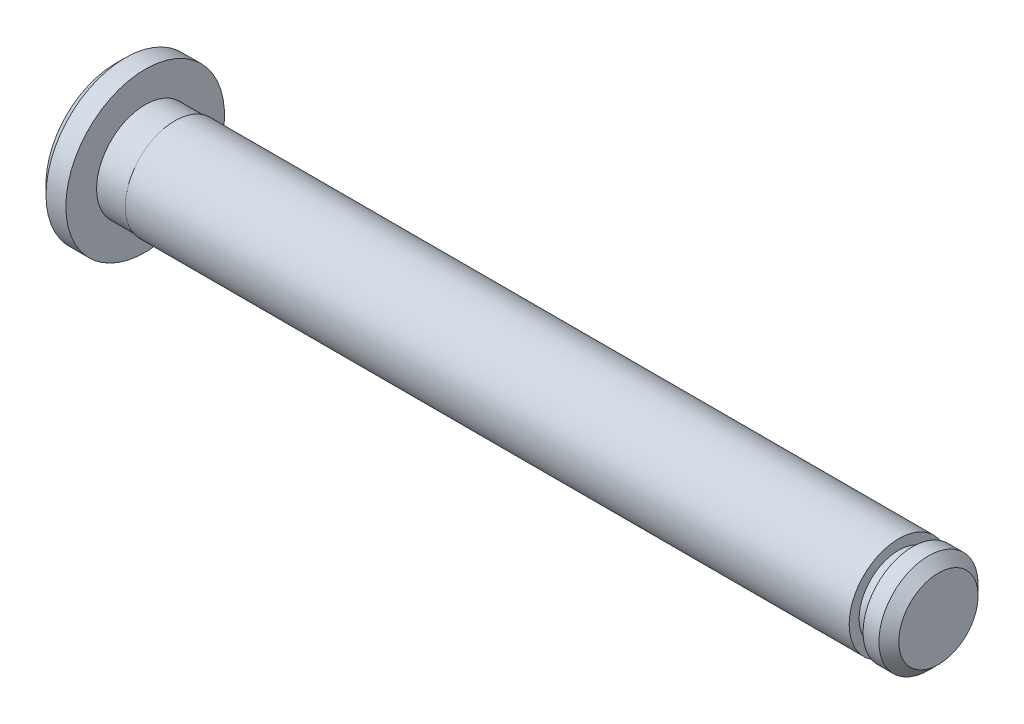
ISO-10303-21;
HEADER;
FILE_DESCRIPTION(('STEP AP214'),'2;1');
FILE_NAME('part.step','',(''),(''),'','','');
FILE_SCHEMA(('AUTOMOTIVE_DESIGN { 1 0 10303 214 1 1 1 1 }'));
ENDSEC;
DATA;
#1=APPLICATION_CONTEXT('core data for automotive mechanical design processes');
#2=APPLICATION_PROTOCOL_DEFINITION('international standard','automotive_design',2000,#1);
#3=PRODUCT_CONTEXT('',#1,'mechanical');
#4=PRODUCT('Part','Part','',(#3));
#5=PRODUCT_RELATED_PRODUCT_CATEGORY('part','',(#4));
#6=PRODUCT_DEFINITION_FORMATION('','',#4);
#7=PRODUCT_DEFINITION_CONTEXT('part definition',#1,'design');
#8=PRODUCT_DEFINITION('design','',#6,#7);
#9=PRODUCT_DEFINITION_SHAPE('','',#8);
#10=(LENGTH_UNIT() NAMED_UNIT(*) SI_UNIT(.MILLI.,.METRE.));
#11=(NAMED_UNIT(*) PLANE_ANGLE_UNIT() SI_UNIT($,.RADIAN.));
#12=(NAMED_UNIT(*) SI_UNIT($,.STERADIAN.) SOLID_ANGLE_UNIT());
#13=UNCERTAINTY_MEASURE_WITH_UNIT(LENGTH_MEASURE(1.E-05),#10,'distance_accuracy_value','');
#14=(GEOMETRIC_REPRESENTATION_CONTEXT(3) GLOBAL_UNCERTAINTY_ASSIGNED_CONTEXT((#13)) GLOBAL_UNIT_ASSIGNED_CONTEXT((#10,
#11,#12)) REPRESENTATION_CONTEXT('',''));
#15=CARTESIAN_POINT('',(0.,0.,0.));
#16=DIRECTION('',(0.,0.,1.));
#17=DIRECTION('',(1.,0.,0.));
#18=AXIS2_PLACEMENT_3D('',#15,#16,#17);
#19=CARTESIAN_POINT('',(-1.5,0.,0.));
#20=DIRECTION('',(1.,0.,0.));
#21=DIRECTION('',(0.,0.,-1.));
#22=AXIS2_PLACEMENT_3D('',#19,#20,#21);
#23=PLANE('',#22);
#24=CARTESIAN_POINT('',(-1.5,0.,0.));
#25=DIRECTION('',(1.,0.,0.));
#26=DIRECTION('',(0.,0.,-1.));
#27=AXIS2_PLACEMENT_3D('',#24,#25,#26);
#28=CIRCLE('',#27,3.50000000000001);
#29=CARTESIAN_POINT('',(-1.5,0.,-3.50000000000001));
#30=VERTEX_POINT('',#29);
#31=EDGE_CURVE('E38',#30,#30,#28,.F.);
#32=ORIENTED_EDGE('',*,*,#31,.T.);
#33=EDGE_LOOP('',(#32));
#34=FACE_BOUND('',#33,.T.);
#35=ADVANCED_FACE('F31',(#34),#23,.F.);
#36=CARTESIAN_POINT('',(0.,0.,0.));
#37=DIRECTION('',(-1.,0.,0.));
#38=DIRECTION('',(0.,0.,1.));
#39=AXIS2_PLACEMENT_3D('',#36,#37,#38);
#40=CYLINDRICAL_SURFACE('',#39,4.);
#41=CARTESIAN_POINT('',(-1.,0.,0.));
#42=DIRECTION('',(1.,0.,0.));
#43=DIRECTION('',(0.,0.,-1.));
#44=AXIS2_PLACEMENT_3D('',#41,#42,#43);
#45=CIRCLE('',#44,4.);
#46=CARTESIAN_POINT('',(-1.,0.,-4.));
#47=VERTEX_POINT('',#46);
#48=EDGE_CURVE('E10',#47,#47,#45,.T.);
#49=ORIENTED_EDGE('',*,*,#48,.T.);
#50=EDGE_LOOP('',(#49));
#51=FACE_BOUND('',#50,.T.);
#52=CARTESIAN_POINT('',(0.,0.,0.));
#53=DIRECTION('',(-1.,0.,0.));
#54=DIRECTION('',(0.,0.,1.));
#55=AXIS2_PLACEMENT_3D('',#52,#53,#54);
#56=CIRCLE('',#55,4.);
#57=CARTESIAN_POINT('',(0.,0.,4.));
#58=VERTEX_POINT('',#57);
#59=EDGE_CURVE('E51',#58,#58,#56,.T.);
#60=ORIENTED_EDGE('',*,*,#59,.T.);
#61=EDGE_LOOP('',(#60));
#62=FACE_BOUND('',#61,.T.);
#63=ADVANCED_FACE('F94',(#51,#62),#40,.T.);
#64=CARTESIAN_POINT('',(0.,4.,0.));
#65=DIRECTION('',(-1.,0.,0.));
#66=DIRECTION('',(0.,0.,1.));
#67=AXIS2_PLACEMENT_3D('',#64,#65,#66);
#68=PLANE('',#67);
#69=ORIENTED_EDGE('',*,*,#59,.F.);
#70=EDGE_LOOP('',(#69));
#71=FACE_BOUND('',#70,.T.);
#72=CARTESIAN_POINT('',(0.,0.,0.));
#73=DIRECTION('',(-1.,0.,0.));
#74=DIRECTION('',(0.,0.,1.));
#75=AXIS2_PLACEMENT_3D('',#72,#73,#74);
#76=CIRCLE('',#75,2.45);
#77=CARTESIAN_POINT('',(0.,0.,2.45));
#78=VERTEX_POINT('',#77);
#79=EDGE_CURVE('E54',#78,#78,#76,.T.);
#80=ORIENTED_EDGE('',*,*,#79,.T.);
#81=EDGE_LOOP('',(#80));
#82=FACE_BOUND('',#81,.T.);
#83=ADVANCED_FACE('F99',(#71,#82),#68,.F.);
#84=CARTESIAN_POINT('',(0.,0.,0.));
#85=DIRECTION('',(-1.,0.,0.));
#86=DIRECTION('',(0.,0.,1.));
#87=AXIS2_PLACEMENT_3D('',#84,#85,#86);
#88=CYLINDRICAL_SURFACE('',#87,2.45);
#89=ORIENTED_EDGE('',*,*,#79,.F.);
#90=EDGE_LOOP('',(#89));
#91=FACE_BOUND('',#90,.T.);
#92=CARTESIAN_POINT('',(1.5,0.,0.));
#93=DIRECTION('',(-1.,0.,0.));
#94=DIRECTION('',(0.,0.,1.));
#95=AXIS2_PLACEMENT_3D('',#92,#93,#94);
#96=CIRCLE('',#95,2.45);
#97=CARTESIAN_POINT('',(1.5,0.,2.45));
#98=VERTEX_POINT('',#97);
#99=EDGE_CURVE('E57',#98,#98,#96,.T.);
#100=ORIENTED_EDGE('',*,*,#99,.T.);
#101=EDGE_LOOP('',(#100));
#102=FACE_BOUND('',#101,.T.);
#103=ADVANCED_FACE('F185',(#91,#102),#88,.T.);
#104=CARTESIAN_POINT('',(1.5,2.45,0.));
#105=DIRECTION('',(1.,0.,0.));
#106=DIRECTION('',(0.,0.,-1.));
#107=AXIS2_PLACEMENT_3D('',#104,#105,#106);
#108=PLANE('',#107);
#109=ORIENTED_EDGE('',*,*,#99,.F.);
#110=EDGE_LOOP('',(#109));
#111=FACE_BOUND('',#110,.T.);
#112=CARTESIAN_POINT('',(1.5,0.,0.));
#113=DIRECTION('',(-1.,0.,0.));
#114=DIRECTION('',(0.,0.,1.));
#115=AXIS2_PLACEMENT_3D('',#112,#113,#114);
#116=CIRCLE('',#115,2.5);
#117=CARTESIAN_POINT('',(1.5,0.,2.5));
#118=VERTEX_POINT('',#117);
#119=EDGE_CURVE('E60',#118,#118,#116,.T.);
#120=ORIENTED_EDGE('',*,*,#119,.T.);
#121=EDGE_LOOP('',(#120));
#122=FACE_BOUND('',#121,.T.);
#123=ADVANCED_FACE('F175',(#111,#122),#108,.F.);
#124=CARTESIAN_POINT('',(0.,0.,0.));
#125=DIRECTION('',(-1.,0.,0.));
#126=DIRECTION('',(0.,0.,1.));
#127=AXIS2_PLACEMENT_3D('',#124,#125,#126);
#128=CYLINDRICAL_SURFACE('',#127,2.5);
#129=ORIENTED_EDGE('',*,*,#119,.F.);
#130=EDGE_LOOP('',(#129));
#131=FACE_BOUND('',#130,.T.);
#132=CARTESIAN_POINT('',(38.,0.,0.));
#133=DIRECTION('',(-1.,0.,0.));
#134=DIRECTION('',(0.,0.,1.));
#135=AXIS2_PLACEMENT_3D('',#132,#133,#134);
#136=CIRCLE('',#135,2.5);
#137=CARTESIAN_POINT('',(38.,0.,2.5));
#138=VERTEX_POINT('',#137);
#139=EDGE_CURVE('E63',#138,#138,#136,.T.);
#140=ORIENTED_EDGE('',*,*,#139,.T.);
#141=EDGE_LOOP('',(#140));
#142=FACE_BOUND('',#141,.T.);
#143=ADVANCED_FACE('F165',(#131,#142),#128,.T.);
#144=CARTESIAN_POINT('',(38.,2.5,0.));
#145=DIRECTION('',(-1.,0.,0.));
#146=DIRECTION('',(0.,0.,1.));
#147=AXIS2_PLACEMENT_3D('',#144,#145,#146);
#148=PLANE('',#147);
#149=ORIENTED_EDGE('',*,*,#139,.F.);
#150=EDGE_LOOP('',(#149));
#151=FACE_BOUND('',#150,.T.);
#152=CARTESIAN_POINT('',(38.,0.,0.));
#153=DIRECTION('',(-1.,0.,0.));
#154=DIRECTION('',(0.,0.,1.));
#155=AXIS2_PLACEMENT_3D('',#152,#153,#154);
#156=CIRCLE('',#155,2.);
#157=CARTESIAN_POINT('',(38.,0.,2.));
#158=VERTEX_POINT('',#157);
#159=EDGE_CURVE('E66',#158,#158,#156,.T.);
#160=ORIENTED_EDGE('',*,*,#159,.T.);
#161=EDGE_LOOP('',(#160));
#162=FACE_BOUND('',#161,.T.);
#163=ADVANCED_FACE('F155',(#151,#162),#148,.F.);
#164=CARTESIAN_POINT('',(0.,0.,0.));
#165=DIRECTION('',(-1.,0.,0.));
#166=DIRECTION('',(0.,0.,1.));
#167=AXIS2_PLACEMENT_3D('',#164,#165,#166);
#168=CYLINDRICAL_SURFACE('',#167,2.);
#169=ORIENTED_EDGE('',*,*,#159,.F.);
#170=EDGE_LOOP('',(#169));
#171=FACE_BOUND('',#170,.T.);
#172=CARTESIAN_POINT('',(38.7,0.,0.));
#173=DIRECTION('',(-1.,0.,0.));
#174=DIRECTION('',(0.,0.,1.));
#175=AXIS2_PLACEMENT_3D('',#172,#173,#174);
#176=CIRCLE('',#175,2.);
#177=CARTESIAN_POINT('',(38.7,0.,2.));
#178=VERTEX_POINT('',#177);
#179=EDGE_CURVE('E69',#178,#178,#176,.T.);
#180=ORIENTED_EDGE('',*,*,#179,.T.);
#181=EDGE_LOOP('',(#180));
#182=FACE_BOUND('',#181,.T.);
#183=ADVANCED_FACE('F90',(#171,#182),#168,.T.);
#184=CARTESIAN_POINT('',(38.7,2.,0.));
#185=DIRECTION('',(1.,0.,0.));
#186=DIRECTION('',(0.,0.,-1.));
#187=AXIS2_PLACEMENT_3D('',#184,#185,#186);
#188=PLANE('',#187);
#189=ORIENTED_EDGE('',*,*,#179,.F.);
#190=EDGE_LOOP('',(#189));
#191=FACE_BOUND('',#190,.T.);
#192=CARTESIAN_POINT('',(38.7,0.,0.));
#193=DIRECTION('',(-1.,0.,0.));
#194=DIRECTION('',(0.,0.,1.));
#195=AXIS2_PLACEMENT_3D('',#192,#193,#194);
#196=CIRCLE('',#195,2.5);
#197=CARTESIAN_POINT('',(38.7,0.,2.5));
#198=VERTEX_POINT('',#197);
#199=EDGE_CURVE('E72',#198,#198,#196,.T.);
#200=ORIENTED_EDGE('',*,*,#199,.T.);
#201=EDGE_LOOP('',(#200));
#202=FACE_BOUND('',#201,.T.);
#203=ADVANCED_FACE('F76',(#191,#202),#188,.F.);
#204=CARTESIAN_POINT('',(0.,0.,0.));
#205=DIRECTION('',(-1.,0.,0.));
#206=DIRECTION('',(0.,0.,1.));
#207=AXIS2_PLACEMENT_3D('',#204,#205,#206);
#208=CYLINDRICAL_SURFACE('',#207,2.5);
#209=CARTESIAN_POINT('',(39.5,0.,0.));
#210=DIRECTION('',(-1.,0.,0.));
#211=DIRECTION('',(0.,0.,1.));
#212=AXIS2_PLACEMENT_3D('',#209,#210,#211);
#213=CIRCLE('',#212,2.5);
#214=CARTESIAN_POINT('',(39.5,0.,2.5));
#215=VERTEX_POINT('',#214);
#216=EDGE_CURVE('E46',#215,#215,#213,.T.);
#217=ORIENTED_EDGE('',*,*,#216,.T.);
#218=EDGE_LOOP('',(#217));
#219=FACE_BOUND('',#218,.T.);
#220=ORIENTED_EDGE('',*,*,#199,.F.);
#221=EDGE_LOOP('',(#220));
#222=FACE_BOUND('',#221,.T.);
#223=ADVANCED_FACE('F78',(#219,#222),#208,.T.);
#224=CARTESIAN_POINT('',(40.,2.5,0.));
#225=DIRECTION('',(-1.,0.,0.));
#226=DIRECTION('',(0.,0.,1.));
#227=AXIS2_PLACEMENT_3D('',#224,#225,#226);
#228=PLANE('',#227);
#229=CARTESIAN_POINT('',(40.,0.,0.));
#230=DIRECTION('',(-1.,0.,0.));
#231=DIRECTION('',(0.,0.,1.));
#232=AXIS2_PLACEMENT_3D('',#229,#230,#231);
#233=CIRCLE('',#232,2.);
#234=CARTESIAN_POINT('',(40.,0.,2.));
#235=VERTEX_POINT('',#234);
#236=EDGE_CURVE('E42',#235,#235,#233,.F.);
#237=ORIENTED_EDGE('',*,*,#236,.T.);
#238=EDGE_LOOP('',(#237));
#239=FACE_BOUND('',#238,.T.);
#240=ADVANCED_FACE('F80',(#239),#228,.F.);
#241=CARTESIAN_POINT('',(39.5,0.,0.));
#242=DIRECTION('',(-1.,0.,0.));
#243=DIRECTION('',(0.,0.,1.));
#244=AXIS2_PLACEMENT_3D('',#241,#242,#243);
#245=CONICAL_SURFACE('',#244,2.5,0.78539816339745);
#246=ORIENTED_EDGE('',*,*,#236,.F.);
#247=EDGE_LOOP('',(#246));
#248=FACE_BOUND('',#247,.T.);
#249=ORIENTED_EDGE('',*,*,#216,.F.);
#250=EDGE_LOOP('',(#249));
#251=FACE_BOUND('',#250,.T.);
#252=ADVANCED_FACE('F87',(#248,#251),#245,.T.);
#253=CARTESIAN_POINT('',(-1.5,0.,0.));
#254=DIRECTION('',(1.,0.,0.));
#255=DIRECTION('',(0.,0.,-1.));
#256=AXIS2_PLACEMENT_3D('',#253,#254,#255);
#257=CONICAL_SURFACE('',#256,3.50000000000001,0.785398163397445);
#258=ORIENTED_EDGE('',*,*,#48,.F.);
#259=EDGE_LOOP('',(#258));
#260=FACE_BOUND('',#259,.T.);
#261=ORIENTED_EDGE('',*,*,#31,.F.);
#262=EDGE_LOOP('',(#261));
#263=FACE_BOUND('',#262,.T.);
#264=ADVANCED_FACE('F33',(#260,#263),#257,.T.);
#265=CLOSED_SHELL('',(#35,#63,#83,#103,#123,#143,#163,#183,#203,#223,#240,#252,#264));
#266=MANIFOLD_SOLID_BREP('B2',#265);
#267=ADVANCED_BREP_SHAPE_REPRESENTATION('',(#18,#266),#14);
#268=SHAPE_DEFINITION_REPRESENTATION(#9,#267);
ENDSEC;
END-ISO-10303-21;
